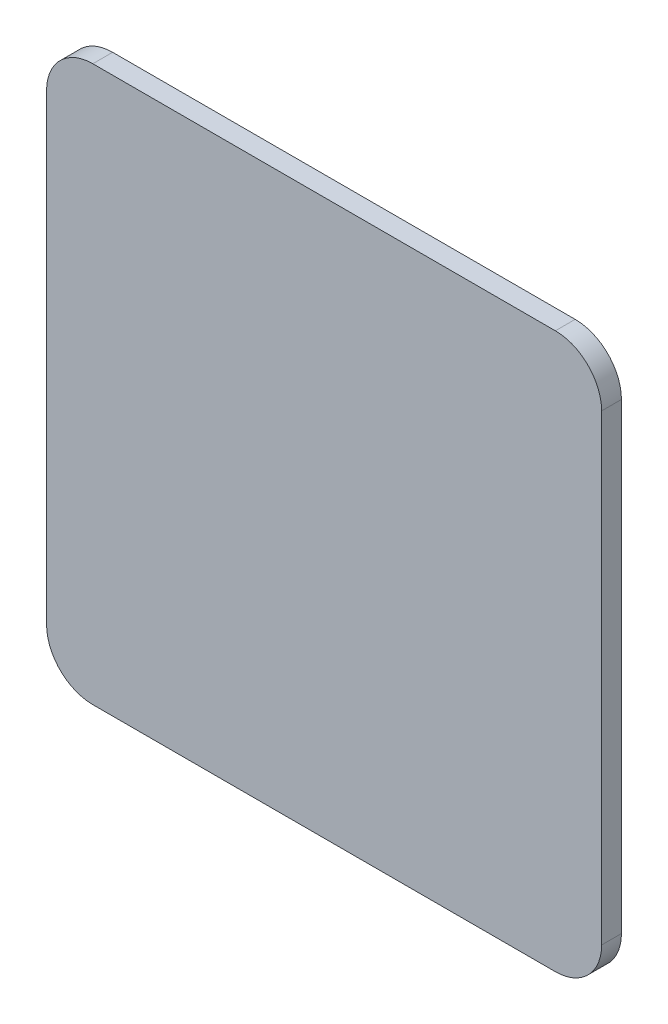
ISO-10303-21;
HEADER;
FILE_DESCRIPTION(('STEP AP214'),'2;1');
FILE_NAME('part.step','',(''),(''),'','','');
FILE_SCHEMA(('AUTOMOTIVE_DESIGN { 1 0 10303 214 1 1 1 1 }'));
ENDSEC;
DATA;
#1=APPLICATION_CONTEXT('core data for automotive mechanical design processes');
#2=APPLICATION_PROTOCOL_DEFINITION('international standard','automotive_design',2000,#1);
#3=PRODUCT_CONTEXT('',#1,'mechanical');
#4=PRODUCT('Part','Part','',(#3));
#5=PRODUCT_RELATED_PRODUCT_CATEGORY('part','',(#4));
#6=PRODUCT_DEFINITION_FORMATION('','',#4);
#7=PRODUCT_DEFINITION_CONTEXT('part definition',#1,'design');
#8=PRODUCT_DEFINITION('design','',#6,#7);
#9=PRODUCT_DEFINITION_SHAPE('','',#8);
#10=(LENGTH_UNIT() NAMED_UNIT(*) SI_UNIT(.MILLI.,.METRE.));
#11=(NAMED_UNIT(*) PLANE_ANGLE_UNIT() SI_UNIT($,.RADIAN.));
#12=(NAMED_UNIT(*) SI_UNIT($,.STERADIAN.) SOLID_ANGLE_UNIT());
#13=UNCERTAINTY_MEASURE_WITH_UNIT(LENGTH_MEASURE(1.E-05),#10,'distance_accuracy_value','');
#14=(GEOMETRIC_REPRESENTATION_CONTEXT(3) GLOBAL_UNCERTAINTY_ASSIGNED_CONTEXT((#13)) GLOBAL_UNIT_ASSIGNED_CONTEXT((#10,
#11,#12)) REPRESENTATION_CONTEXT('',''));
#15=CARTESIAN_POINT('',(0.,0.,0.));
#16=DIRECTION('',(0.,0.,1.));
#17=DIRECTION('',(1.,0.,0.));
#18=AXIS2_PLACEMENT_3D('',#15,#16,#17);
#19=CARTESIAN_POINT('',(42.,-42.,3.));
#20=DIRECTION('',(-1.,0.,0.));
#21=DIRECTION('',(0.,0.,1.));
#22=AXIS2_PLACEMENT_3D('',#19,#20,#21);
#23=PLANE('',#22);
#24=DIRECTION('',(0.,1.,0.));
#25=VECTOR('',#24,1.);
#26=CARTESIAN_POINT('',(42.,-42.,3.));
#27=LINE('',#26,#25);
#28=CARTESIAN_POINT('',(42.,-35.,3.));
#29=VERTEX_POINT('',#28);
#30=CARTESIAN_POINT('',(42.,35.,3.));
#31=VERTEX_POINT('',#30);
#32=EDGE_CURVE('E142',#29,#31,#27,.T.);
#33=ORIENTED_EDGE('',*,*,#32,.F.);
#34=DIRECTION('',(0.,0.,-1.));
#35=VECTOR('',#34,1.);
#36=CARTESIAN_POINT('',(42.,-35.,3.));
#37=LINE('',#36,#35);
#38=CARTESIAN_POINT('',(42.,-35.,0.));
#39=VERTEX_POINT('',#38);
#40=EDGE_CURVE('E11',#29,#39,#37,.T.);
#41=ORIENTED_EDGE('',*,*,#40,.T.);
#42=DIRECTION('',(0.,1.,0.));
#43=VECTOR('',#42,1.);
#44=CARTESIAN_POINT('',(42.,-42.,0.));
#45=LINE('',#44,#43);
#46=CARTESIAN_POINT('',(42.,35.,0.));
#47=VERTEX_POINT('',#46);
#48=EDGE_CURVE('E145',#39,#47,#45,.T.);
#49=ORIENTED_EDGE('',*,*,#48,.T.);
#50=DIRECTION('',(0.,0.,-1.));
#51=VECTOR('',#50,1.);
#52=CARTESIAN_POINT('',(42.,35.,3.));
#53=LINE('',#52,#51);
#54=EDGE_CURVE('E47',#47,#31,#53,.F.);
#55=ORIENTED_EDGE('',*,*,#54,.T.);
#56=EDGE_LOOP('',(#33,#41,#49,#55));
#57=FACE_BOUND('',#56,.T.);
#58=ADVANCED_FACE('F39',(#57),#23,.F.);
#59=CARTESIAN_POINT('',(-42.,42.,3.));
#60=DIRECTION('',(0.,-1.,0.));
#61=DIRECTION('',(0.,0.,-1.));
#62=AXIS2_PLACEMENT_3D('',#59,#60,#61);
#63=PLANE('',#62);
#64=DIRECTION('',(-1.,0.,0.));
#65=VECTOR('',#64,1.);
#66=CARTESIAN_POINT('',(-42.,42.,0.));
#67=LINE('',#66,#65);
#68=CARTESIAN_POINT('',(35.,42.,0.));
#69=VERTEX_POINT('',#68);
#70=CARTESIAN_POINT('',(-35.,42.,0.));
#71=VERTEX_POINT('',#70);
#72=EDGE_CURVE('E139',#69,#71,#67,.T.);
#73=ORIENTED_EDGE('',*,*,#72,.T.);
#74=DIRECTION('',(0.,0.,-1.));
#75=VECTOR('',#74,1.);
#76=CARTESIAN_POINT('',(-35.,42.,3.));
#77=LINE('',#76,#75);
#78=CARTESIAN_POINT('',(-35.,42.,3.));
#79=VERTEX_POINT('',#78);
#80=EDGE_CURVE('E115',#71,#79,#77,.F.);
#81=ORIENTED_EDGE('',*,*,#80,.T.);
#82=DIRECTION('',(-1.,0.,0.));
#83=VECTOR('',#82,1.);
#84=CARTESIAN_POINT('',(-42.,42.,3.));
#85=LINE('',#84,#83);
#86=CARTESIAN_POINT('',(35.,42.,3.));
#87=VERTEX_POINT('',#86);
#88=EDGE_CURVE('E183',#87,#79,#85,.T.);
#89=ORIENTED_EDGE('',*,*,#88,.F.);
#90=DIRECTION('',(0.,0.,-1.));
#91=VECTOR('',#90,1.);
#92=CARTESIAN_POINT('',(35.,42.,3.));
#93=LINE('',#92,#91);
#94=EDGE_CURVE('E121',#87,#69,#93,.T.);
#95=ORIENTED_EDGE('',*,*,#94,.T.);
#96=EDGE_LOOP('',(#73,#81,#89,#95));
#97=FACE_BOUND('',#96,.T.);
#98=ADVANCED_FACE('F187',(#97),#63,.F.);
#99=CARTESIAN_POINT('',(-42.,-42.,3.));
#100=DIRECTION('',(1.,0.,0.));
#101=DIRECTION('',(0.,0.,-1.));
#102=AXIS2_PLACEMENT_3D('',#99,#100,#101);
#103=PLANE('',#102);
#104=DIRECTION('',(0.,-1.,0.));
#105=VECTOR('',#104,1.);
#106=CARTESIAN_POINT('',(-42.,-42.,3.));
#107=LINE('',#106,#105);
#108=CARTESIAN_POINT('',(-42.,35.,3.));
#109=VERTEX_POINT('',#108);
#110=CARTESIAN_POINT('',(-42.,-35.,3.));
#111=VERTEX_POINT('',#110);
#112=EDGE_CURVE('E130',#109,#111,#107,.T.);
#113=ORIENTED_EDGE('',*,*,#112,.F.);
#114=DIRECTION('',(0.,0.,-1.));
#115=VECTOR('',#114,1.);
#116=CARTESIAN_POINT('',(-42.,35.,3.));
#117=LINE('',#116,#115);
#118=CARTESIAN_POINT('',(-42.,35.,0.));
#119=VERTEX_POINT('',#118);
#120=EDGE_CURVE('E114',#109,#119,#117,.T.);
#121=ORIENTED_EDGE('',*,*,#120,.T.);
#122=DIRECTION('',(0.,-1.,0.));
#123=VECTOR('',#122,1.);
#124=CARTESIAN_POINT('',(-42.,-42.,0.));
#125=LINE('',#124,#123);
#126=CARTESIAN_POINT('',(-42.,-35.,0.));
#127=VERTEX_POINT('',#126);
#128=EDGE_CURVE('E128',#119,#127,#125,.T.);
#129=ORIENTED_EDGE('',*,*,#128,.T.);
#130=DIRECTION('',(0.,0.,-1.));
#131=VECTOR('',#130,1.);
#132=CARTESIAN_POINT('',(-42.,-35.,3.));
#133=LINE('',#132,#131);
#134=EDGE_CURVE('E133',#127,#111,#133,.F.);
#135=ORIENTED_EDGE('',*,*,#134,.T.);
#136=EDGE_LOOP('',(#113,#121,#129,#135));
#137=FACE_BOUND('',#136,.T.);
#138=ADVANCED_FACE('F127',(#137),#103,.F.);
#139=CARTESIAN_POINT('',(-42.,-42.,3.));
#140=DIRECTION('',(0.,1.,0.));
#141=DIRECTION('',(0.,0.,1.));
#142=AXIS2_PLACEMENT_3D('',#139,#140,#141);
#143=PLANE('',#142);
#144=DIRECTION('',(1.,0.,0.));
#145=VECTOR('',#144,1.);
#146=CARTESIAN_POINT('',(-42.,-42.,3.));
#147=LINE('',#146,#145);
#148=CARTESIAN_POINT('',(-35.,-42.,3.));
#149=VERTEX_POINT('',#148);
#150=CARTESIAN_POINT('',(35.,-42.,3.));
#151=VERTEX_POINT('',#150);
#152=EDGE_CURVE('E149',#149,#151,#147,.T.);
#153=ORIENTED_EDGE('',*,*,#152,.F.);
#154=DIRECTION('',(0.,0.,-1.));
#155=VECTOR('',#154,1.);
#156=CARTESIAN_POINT('',(-35.,-42.,3.));
#157=LINE('',#156,#155);
#158=CARTESIAN_POINT('',(-35.,-42.,0.));
#159=VERTEX_POINT('',#158);
#160=EDGE_CURVE('E168',#149,#159,#157,.T.);
#161=ORIENTED_EDGE('',*,*,#160,.T.);
#162=DIRECTION('',(1.,0.,0.));
#163=VECTOR('',#162,1.);
#164=CARTESIAN_POINT('',(-42.,-42.,0.));
#165=LINE('',#164,#163);
#166=CARTESIAN_POINT('',(35.,-42.,0.));
#167=VERTEX_POINT('',#166);
#168=EDGE_CURVE('E138',#159,#167,#165,.T.);
#169=ORIENTED_EDGE('',*,*,#168,.T.);
#170=DIRECTION('',(0.,0.,-1.));
#171=VECTOR('',#170,1.);
#172=CARTESIAN_POINT('',(35.,-42.,3.));
#173=LINE('',#172,#171);
#174=EDGE_CURVE('E54',#167,#151,#173,.F.);
#175=ORIENTED_EDGE('',*,*,#174,.T.);
#176=EDGE_LOOP('',(#153,#161,#169,#175));
#177=FACE_BOUND('',#176,.T.);
#178=ADVANCED_FACE('F195',(#177),#143,.F.);
#179=CARTESIAN_POINT('',(0.,0.,3.));
#180=DIRECTION('',(0.,0.,-1.));
#181=DIRECTION('',(-1.,0.,0.));
#182=AXIS2_PLACEMENT_3D('',#179,#180,#181);
#183=PLANE('',#182);
#184=ORIENTED_EDGE('',*,*,#88,.T.);
#185=CARTESIAN_POINT('',(-35.,35.,3.));
#186=DIRECTION('',(0.,0.,-1.));
#187=DIRECTION('',(-1.,0.,0.));
#188=AXIS2_PLACEMENT_3D('',#185,#186,#187);
#189=CIRCLE('',#188,7.);
#190=EDGE_CURVE('E164',#79,#109,#189,.F.);
#191=ORIENTED_EDGE('',*,*,#190,.T.);
#192=ORIENTED_EDGE('',*,*,#112,.T.);
#193=CARTESIAN_POINT('',(-35.,-35.,3.));
#194=DIRECTION('',(0.,0.,-1.));
#195=DIRECTION('',(-1.,0.,0.));
#196=AXIS2_PLACEMENT_3D('',#193,#194,#195);
#197=CIRCLE('',#196,7.);
#198=EDGE_CURVE('E61',#111,#149,#197,.F.);
#199=ORIENTED_EDGE('',*,*,#198,.T.);
#200=ORIENTED_EDGE('',*,*,#152,.T.);
#201=CARTESIAN_POINT('',(35.,-35.,3.));
#202=DIRECTION('',(0.,0.,-1.));
#203=DIRECTION('',(-1.,0.,0.));
#204=AXIS2_PLACEMENT_3D('',#201,#202,#203);
#205=CIRCLE('',#204,7.);
#206=EDGE_CURVE('E161',#151,#29,#205,.F.);
#207=ORIENTED_EDGE('',*,*,#206,.T.);
#208=ORIENTED_EDGE('',*,*,#32,.T.);
#209=CARTESIAN_POINT('',(35.,35.,3.));
#210=DIRECTION('',(0.,0.,-1.));
#211=DIRECTION('',(-1.,0.,0.));
#212=AXIS2_PLACEMENT_3D('',#209,#210,#211);
#213=CIRCLE('',#212,7.);
#214=EDGE_CURVE('E159',#31,#87,#213,.F.);
#215=ORIENTED_EDGE('',*,*,#214,.T.);
#216=EDGE_LOOP('',(#184,#191,#192,#199,#200,#207,#208,#215));
#217=FACE_BOUND('',#216,.T.);
#218=ADVANCED_FACE('F180',(#217),#183,.F.);
#219=CARTESIAN_POINT('',(0.,0.,0.));
#220=DIRECTION('',(0.,0.,-1.));
#221=DIRECTION('',(-1.,0.,0.));
#222=AXIS2_PLACEMENT_3D('',#219,#220,#221);
#223=PLANE('',#222);
#224=ORIENTED_EDGE('',*,*,#128,.F.);
#225=CARTESIAN_POINT('',(-35.,35.,0.));
#226=DIRECTION('',(0.,0.,-1.));
#227=DIRECTION('',(-1.,0.,0.));
#228=AXIS2_PLACEMENT_3D('',#225,#226,#227);
#229=CIRCLE('',#228,7.);
#230=EDGE_CURVE('E110',#119,#71,#229,.T.);
#231=ORIENTED_EDGE('',*,*,#230,.T.);
#232=ORIENTED_EDGE('',*,*,#72,.F.);
#233=CARTESIAN_POINT('',(35.,35.,0.));
#234=DIRECTION('',(0.,0.,-1.));
#235=DIRECTION('',(-1.,0.,0.));
#236=AXIS2_PLACEMENT_3D('',#233,#234,#235);
#237=CIRCLE('',#236,7.);
#238=EDGE_CURVE('E132',#69,#47,#237,.T.);
#239=ORIENTED_EDGE('',*,*,#238,.T.);
#240=ORIENTED_EDGE('',*,*,#48,.F.);
#241=CARTESIAN_POINT('',(35.,-35.,0.));
#242=DIRECTION('',(0.,0.,-1.));
#243=DIRECTION('',(-1.,0.,0.));
#244=AXIS2_PLACEMENT_3D('',#241,#242,#243);
#245=CIRCLE('',#244,7.);
#246=EDGE_CURVE('E152',#39,#167,#245,.T.);
#247=ORIENTED_EDGE('',*,*,#246,.T.);
#248=ORIENTED_EDGE('',*,*,#168,.F.);
#249=CARTESIAN_POINT('',(-35.,-35.,0.));
#250=DIRECTION('',(0.,0.,-1.));
#251=DIRECTION('',(-1.,0.,0.));
#252=AXIS2_PLACEMENT_3D('',#249,#250,#251);
#253=CIRCLE('',#252,7.);
#254=EDGE_CURVE('E122',#159,#127,#253,.T.);
#255=ORIENTED_EDGE('',*,*,#254,.T.);
#256=EDGE_LOOP('',(#224,#231,#232,#239,#240,#247,#248,#255));
#257=FACE_BOUND('',#256,.T.);
#258=ADVANCED_FACE('F135',(#257),#223,.T.);
#259=CARTESIAN_POINT('',(-35.,35.,3.));
#260=DIRECTION('',(0.,0.,-1.));
#261=DIRECTION('',(-1.,0.,0.));
#262=AXIS2_PLACEMENT_3D('',#259,#260,#261);
#263=CYLINDRICAL_SURFACE('',#262,7.);
#264=ORIENTED_EDGE('',*,*,#190,.F.);
#265=ORIENTED_EDGE('',*,*,#80,.F.);
#266=ORIENTED_EDGE('',*,*,#230,.F.);
#267=ORIENTED_EDGE('',*,*,#120,.F.);
#268=EDGE_LOOP('',(#264,#265,#266,#267));
#269=FACE_BOUND('',#268,.T.);
#270=ADVANCED_FACE('F113',(#269),#263,.T.);
#271=CARTESIAN_POINT('',(-35.,-35.,3.));
#272=DIRECTION('',(0.,0.,-1.));
#273=DIRECTION('',(-1.,0.,0.));
#274=AXIS2_PLACEMENT_3D('',#271,#272,#273);
#275=CYLINDRICAL_SURFACE('',#274,7.);
#276=ORIENTED_EDGE('',*,*,#198,.F.);
#277=ORIENTED_EDGE('',*,*,#134,.F.);
#278=ORIENTED_EDGE('',*,*,#254,.F.);
#279=ORIENTED_EDGE('',*,*,#160,.F.);
#280=EDGE_LOOP('',(#276,#277,#278,#279));
#281=FACE_BOUND('',#280,.T.);
#282=ADVANCED_FACE('F194',(#281),#275,.T.);
#283=CARTESIAN_POINT('',(35.,-35.,3.));
#284=DIRECTION('',(0.,0.,-1.));
#285=DIRECTION('',(-1.,0.,0.));
#286=AXIS2_PLACEMENT_3D('',#283,#284,#285);
#287=CYLINDRICAL_SURFACE('',#286,7.);
#288=ORIENTED_EDGE('',*,*,#206,.F.);
#289=ORIENTED_EDGE('',*,*,#174,.F.);
#290=ORIENTED_EDGE('',*,*,#246,.F.);
#291=ORIENTED_EDGE('',*,*,#40,.F.);
#292=EDGE_LOOP('',(#288,#289,#290,#291));
#293=FACE_BOUND('',#292,.T.);
#294=ADVANCED_FACE('F197',(#293),#287,.T.);
#295=CARTESIAN_POINT('',(35.,35.,3.));
#296=DIRECTION('',(0.,0.,-1.));
#297=DIRECTION('',(-1.,0.,0.));
#298=AXIS2_PLACEMENT_3D('',#295,#296,#297);
#299=CYLINDRICAL_SURFACE('',#298,7.);
#300=ORIENTED_EDGE('',*,*,#214,.F.);
#301=ORIENTED_EDGE('',*,*,#54,.F.);
#302=ORIENTED_EDGE('',*,*,#238,.F.);
#303=ORIENTED_EDGE('',*,*,#94,.F.);
#304=EDGE_LOOP('',(#300,#301,#302,#303));
#305=FACE_BOUND('',#304,.T.);
#306=ADVANCED_FACE('F41',(#305),#299,.T.);
#307=CLOSED_SHELL('',(#58,#98,#138,#178,#218,#258,#270,#282,#294,#306));
#308=MANIFOLD_SOLID_BREP('B2',#307);
#309=ADVANCED_BREP_SHAPE_REPRESENTATION('',(#18,#308),#14);
#310=SHAPE_DEFINITION_REPRESENTATION(#9,#309);
ENDSEC;
END-ISO-10303-21;
